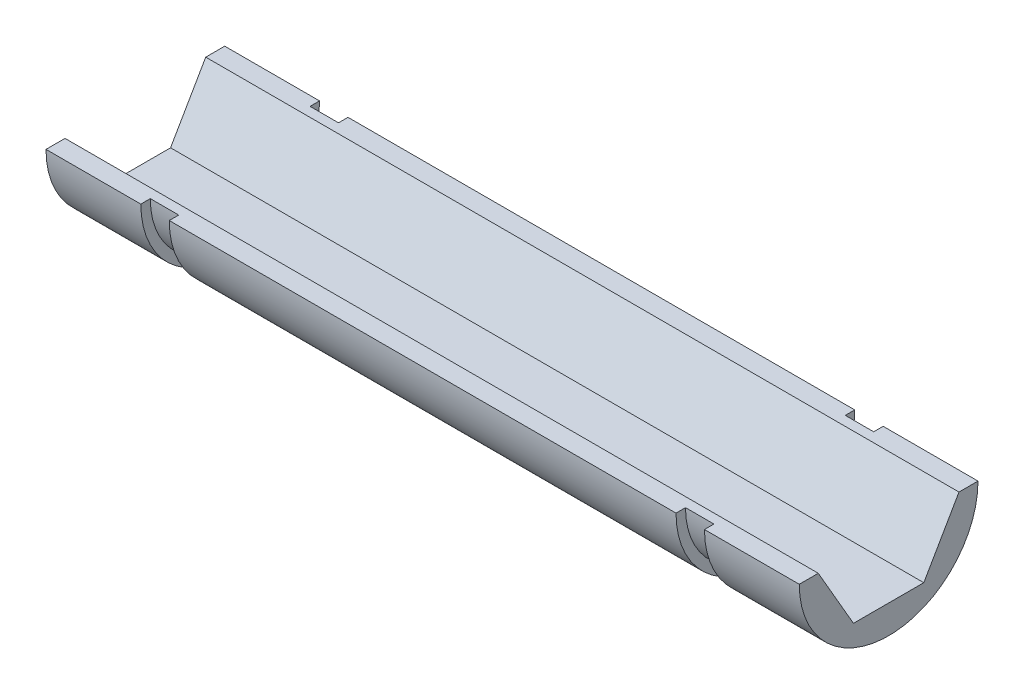
ISO-10303-21;
HEADER;
FILE_DESCRIPTION(('STEP AP214'),'2;1');
FILE_NAME('part.step','',(''),(''),'','','');
FILE_SCHEMA(('AUTOMOTIVE_DESIGN { 1 0 10303 214 1 1 1 1 }'));
ENDSEC;
DATA;
#1=APPLICATION_CONTEXT('core data for automotive mechanical design processes');
#2=APPLICATION_PROTOCOL_DEFINITION('international standard','automotive_design',2000,#1);
#3=PRODUCT_CONTEXT('',#1,'mechanical');
#4=PRODUCT('Part','Part','',(#3));
#5=PRODUCT_RELATED_PRODUCT_CATEGORY('part','',(#4));
#6=PRODUCT_DEFINITION_FORMATION('','',#4);
#7=PRODUCT_DEFINITION_CONTEXT('part definition',#1,'design');
#8=PRODUCT_DEFINITION('design','',#6,#7);
#9=PRODUCT_DEFINITION_SHAPE('','',#8);
#10=(LENGTH_UNIT() NAMED_UNIT(*) SI_UNIT(.MILLI.,.METRE.));
#11=(NAMED_UNIT(*) PLANE_ANGLE_UNIT() SI_UNIT($,.RADIAN.));
#12=(NAMED_UNIT(*) SI_UNIT($,.STERADIAN.) SOLID_ANGLE_UNIT());
#13=UNCERTAINTY_MEASURE_WITH_UNIT(LENGTH_MEASURE(1.E-05),#10,'distance_accuracy_value','');
#14=(GEOMETRIC_REPRESENTATION_CONTEXT(3) GLOBAL_UNCERTAINTY_ASSIGNED_CONTEXT((#13)) GLOBAL_UNIT_ASSIGNED_CONTEXT((#10,
#11,#12)) REPRESENTATION_CONTEXT('',''));
#15=CARTESIAN_POINT('',(0.,0.,0.));
#16=DIRECTION('',(0.,0.,1.));
#17=DIRECTION('',(1.,0.,0.));
#18=AXIS2_PLACEMENT_3D('',#15,#16,#17);
#19=CARTESIAN_POINT('',(0.,0.,0.));
#20=DIRECTION('',(0.,1.,0.));
#21=DIRECTION('',(0.,0.,1.));
#22=AXIS2_PLACEMENT_3D('',#19,#20,#21);
#23=PLANE('',#22);
#24=DIRECTION('',(-1.,0.,0.));
#25=VECTOR('',#24,1.);
#26=CARTESIAN_POINT('',(79.4512,0.,-9.4262));
#27=LINE('',#26,#25);
#28=CARTESIAN_POINT('',(10.,0.,-9.4262));
#29=VERTEX_POINT('',#28);
#30=CARTESIAN_POINT('',(0.,0.,-9.4262));
#31=VERTEX_POINT('',#30);
#32=EDGE_CURVE('E164',#29,#31,#27,.T.);
#33=ORIENTED_EDGE('',*,*,#32,.T.);
#34=DIRECTION('',(0.,0.,1.));
#35=VECTOR('',#34,1.);
#36=CARTESIAN_POINT('',(0.,0.,0.));
#37=LINE('',#36,#35);
#38=CARTESIAN_POINT('',(0.,0.,-7.42033659973275));
#39=VERTEX_POINT('',#38);
#40=EDGE_CURVE('E170',#31,#39,#37,.T.);
#41=ORIENTED_EDGE('',*,*,#40,.T.);
#42=DIRECTION('',(-1.,0.,0.));
#43=VECTOR('',#42,1.);
#44=CARTESIAN_POINT('',(79.4512,0.,-7.42033659973275));
#45=LINE('',#44,#43);
#46=CARTESIAN_POINT('',(79.4512,0.,-7.42033659973275));
#47=VERTEX_POINT('',#46);
#48=EDGE_CURVE('E89',#47,#39,#45,.T.);
#49=ORIENTED_EDGE('',*,*,#48,.F.);
#50=DIRECTION('',(0.,0.,1.));
#51=VECTOR('',#50,1.);
#52=CARTESIAN_POINT('',(79.4512,0.,0.));
#53=LINE('',#52,#51);
#54=CARTESIAN_POINT('',(79.4512,0.,-9.4262));
#55=VERTEX_POINT('',#54);
#56=EDGE_CURVE('E114',#55,#47,#53,.T.);
#57=ORIENTED_EDGE('',*,*,#56,.F.);
#58=DIRECTION('',(-1.,0.,0.));
#59=VECTOR('',#58,1.);
#60=CARTESIAN_POINT('',(79.4512,0.,-9.4262));
#61=LINE('',#60,#59);
#62=CARTESIAN_POINT('',(69.4512,0.,-9.4262));
#63=VERTEX_POINT('',#62);
#64=EDGE_CURVE('E152',#55,#63,#61,.T.);
#65=ORIENTED_EDGE('',*,*,#64,.T.);
#66=DIRECTION('',(0.,0.,-1.));
#67=VECTOR('',#66,1.);
#68=CARTESIAN_POINT('',(69.4512,0.,0.));
#69=LINE('',#68,#67);
#70=CARTESIAN_POINT('',(69.4512,0.,-8.4262));
#71=VERTEX_POINT('',#70);
#72=EDGE_CURVE('E132',#71,#63,#69,.T.);
#73=ORIENTED_EDGE('',*,*,#72,.F.);
#74=DIRECTION('',(1.,0.,0.));
#75=VECTOR('',#74,1.);
#76=CARTESIAN_POINT('',(81.0006,0.,-8.4262));
#77=LINE('',#76,#75);
#78=CARTESIAN_POINT('',(66.4512,0.,-8.4262));
#79=VERTEX_POINT('',#78);
#80=EDGE_CURVE('E126',#79,#71,#77,.T.);
#81=ORIENTED_EDGE('',*,*,#80,.F.);
#82=DIRECTION('',(0.,0.,1.));
#83=VECTOR('',#82,1.);
#84=CARTESIAN_POINT('',(66.4512,0.,0.));
#85=LINE('',#84,#83);
#86=CARTESIAN_POINT('',(66.4512,0.,-9.4262));
#87=VERTEX_POINT('',#86);
#88=EDGE_CURVE('E125',#87,#79,#85,.T.);
#89=ORIENTED_EDGE('',*,*,#88,.F.);
#90=DIRECTION('',(-1.,0.,0.));
#91=VECTOR('',#90,1.);
#92=CARTESIAN_POINT('',(79.4512,0.,-9.4262));
#93=LINE('',#92,#91);
#94=CARTESIAN_POINT('',(13.,0.,-9.4262));
#95=VERTEX_POINT('',#94);
#96=EDGE_CURVE('E158',#87,#95,#93,.T.);
#97=ORIENTED_EDGE('',*,*,#96,.T.);
#98=DIRECTION('',(0.,0.,-1.));
#99=VECTOR('',#98,1.);
#100=CARTESIAN_POINT('',(13.,0.,0.));
#101=LINE('',#100,#99);
#102=CARTESIAN_POINT('',(13.,0.,-8.4262));
#103=VERTEX_POINT('',#102);
#104=EDGE_CURVE('E136',#103,#95,#101,.T.);
#105=ORIENTED_EDGE('',*,*,#104,.F.);
#106=DIRECTION('',(-1.,0.,0.));
#107=VECTOR('',#106,1.);
#108=CARTESIAN_POINT('',(-1.5494,0.,-8.4262));
#109=LINE('',#108,#107);
#110=CARTESIAN_POINT('',(10.,0.,-8.4262));
#111=VERTEX_POINT('',#110);
#112=EDGE_CURVE('E143',#111,#103,#109,.F.);
#113=ORIENTED_EDGE('',*,*,#112,.F.);
#114=DIRECTION('',(0.,0.,1.));
#115=VECTOR('',#114,1.);
#116=CARTESIAN_POINT('',(10.,0.,0.));
#117=LINE('',#116,#115);
#118=EDGE_CURVE('E147',#29,#111,#117,.T.);
#119=ORIENTED_EDGE('',*,*,#118,.F.);
#120=EDGE_LOOP('',(#33,#41,#49,#57,#65,#73,#81,#89,#97,#105,#113,#119));
#121=FACE_BOUND('',#120,.T.);
#122=ADVANCED_FACE('F59',(#121),#23,.T.);
#123=DIRECTION('',(-1.,0.,0.));
#124=VECTOR('',#123,1.);
#125=CARTESIAN_POINT('',(79.4512,0.,7.42033659973275));
#126=LINE('',#125,#124);
#127=CARTESIAN_POINT('',(79.4512,0.,7.42033659973275));
#128=VERTEX_POINT('',#127);
#129=CARTESIAN_POINT('',(0.,0.,7.42033659973275));
#130=VERTEX_POINT('',#129);
#131=EDGE_CURVE('E174',#128,#130,#126,.T.);
#132=ORIENTED_EDGE('',*,*,#131,.T.);
#133=CARTESIAN_POINT('',(0.,0.,9.4262));
#134=VERTEX_POINT('',#133);
#135=EDGE_CURVE('E171',#130,#134,#37,.T.);
#136=ORIENTED_EDGE('',*,*,#135,.T.);
#137=DIRECTION('',(-1.,0.,0.));
#138=VECTOR('',#137,1.);
#139=CARTESIAN_POINT('',(79.4512,0.,9.4262));
#140=LINE('',#139,#138);
#141=CARTESIAN_POINT('',(10.,0.,9.4262));
#142=VERTEX_POINT('',#141);
#143=EDGE_CURVE('E167',#134,#142,#140,.F.);
#144=ORIENTED_EDGE('',*,*,#143,.T.);
#145=CARTESIAN_POINT('',(10.,0.,8.4262));
#146=VERTEX_POINT('',#145);
#147=EDGE_CURVE('E146',#146,#142,#117,.T.);
#148=ORIENTED_EDGE('',*,*,#147,.F.);
#149=DIRECTION('',(-1.,0.,0.));
#150=VECTOR('',#149,1.);
#151=CARTESIAN_POINT('',(-1.5494,0.,8.4262));
#152=LINE('',#151,#150);
#153=CARTESIAN_POINT('',(13.,0.,8.4262));
#154=VERTEX_POINT('',#153);
#155=EDGE_CURVE('E140',#154,#146,#152,.T.);
#156=ORIENTED_EDGE('',*,*,#155,.F.);
#157=CARTESIAN_POINT('',(13.,0.,9.4262));
#158=VERTEX_POINT('',#157);
#159=EDGE_CURVE('E137',#158,#154,#101,.T.);
#160=ORIENTED_EDGE('',*,*,#159,.F.);
#161=DIRECTION('',(-1.,0.,0.));
#162=VECTOR('',#161,1.);
#163=CARTESIAN_POINT('',(79.4512,0.,9.4262));
#164=LINE('',#163,#162);
#165=CARTESIAN_POINT('',(66.4512,0.,9.4262));
#166=VERTEX_POINT('',#165);
#167=EDGE_CURVE('E161',#158,#166,#164,.F.);
#168=ORIENTED_EDGE('',*,*,#167,.T.);
#169=CARTESIAN_POINT('',(66.4512,0.,8.4262));
#170=VERTEX_POINT('',#169);
#171=EDGE_CURVE('E121',#170,#166,#85,.T.);
#172=ORIENTED_EDGE('',*,*,#171,.F.);
#173=DIRECTION('',(1.,0.,0.));
#174=VECTOR('',#173,1.);
#175=CARTESIAN_POINT('',(81.0006,0.,8.4262));
#176=LINE('',#175,#174);
#177=CARTESIAN_POINT('',(69.4512,0.,8.4262));
#178=VERTEX_POINT('',#177);
#179=EDGE_CURVE('E129',#178,#170,#176,.F.);
#180=ORIENTED_EDGE('',*,*,#179,.F.);
#181=CARTESIAN_POINT('',(69.4512,0.,9.4262));
#182=VERTEX_POINT('',#181);
#183=EDGE_CURVE('E133',#182,#178,#69,.T.);
#184=ORIENTED_EDGE('',*,*,#183,.F.);
#185=DIRECTION('',(-1.,0.,0.));
#186=VECTOR('',#185,1.);
#187=CARTESIAN_POINT('',(79.4512,0.,9.4262));
#188=LINE('',#187,#186);
#189=CARTESIAN_POINT('',(79.4512,0.,9.4262));
#190=VERTEX_POINT('',#189);
#191=EDGE_CURVE('E155',#182,#190,#188,.F.);
#192=ORIENTED_EDGE('',*,*,#191,.T.);
#193=EDGE_CURVE('E150',#128,#190,#53,.T.);
#194=ORIENTED_EDGE('',*,*,#193,.F.);
#195=EDGE_LOOP('',(#132,#136,#144,#148,#156,#160,#168,#172,#180,#184,#192,#194));
#196=FACE_BOUND('',#195,.T.);
#197=ADVANCED_FACE('F258',(#196),#23,.T.);
#198=CARTESIAN_POINT('',(79.4512,0.,0.));
#199=DIRECTION('',(-1.,0.,0.));
#200=DIRECTION('',(0.,0.,1.));
#201=AXIS2_PLACEMENT_3D('',#198,#199,#200);
#202=CYLINDRICAL_SURFACE('',#201,9.4262);
#203=ORIENTED_EDGE('',*,*,#32,.F.);
#204=CARTESIAN_POINT('',(10.,0.,0.));
#205=DIRECTION('',(-1.,0.,0.));
#206=DIRECTION('',(0.,0.,1.));
#207=AXIS2_PLACEMENT_3D('',#204,#205,#206);
#208=CIRCLE('',#207,9.4262);
#209=EDGE_CURVE('E190',#29,#142,#208,.T.);
#210=ORIENTED_EDGE('',*,*,#209,.T.);
#211=ORIENTED_EDGE('',*,*,#143,.F.);
#212=CARTESIAN_POINT('',(0.,0.,0.));
#213=DIRECTION('',(1.,0.,0.));
#214=DIRECTION('',(0.,0.,-1.));
#215=AXIS2_PLACEMENT_3D('',#212,#213,#214);
#216=CIRCLE('',#215,9.4262);
#217=EDGE_CURVE('E110',#134,#31,#216,.T.);
#218=ORIENTED_EDGE('',*,*,#217,.T.);
#219=EDGE_LOOP('',(#203,#210,#211,#218));
#220=FACE_BOUND('',#219,.T.);
#221=ADVANCED_FACE('F244',(#220),#202,.T.);
#222=CARTESIAN_POINT('',(10.,9.4262,0.));
#223=DIRECTION('',(1.,0.,0.));
#224=DIRECTION('',(0.,0.,-1.));
#225=AXIS2_PLACEMENT_3D('',#222,#223,#224);
#226=PLANE('',#225);
#227=ORIENTED_EDGE('',*,*,#209,.F.);
#228=ORIENTED_EDGE('',*,*,#118,.T.);
#229=CARTESIAN_POINT('',(10.,0.,0.));
#230=DIRECTION('',(-1.,0.,0.));
#231=DIRECTION('',(0.,0.,1.));
#232=AXIS2_PLACEMENT_3D('',#229,#230,#231);
#233=CIRCLE('',#232,8.4262);
#234=EDGE_CURVE('E180',#111,#146,#233,.T.);
#235=ORIENTED_EDGE('',*,*,#234,.T.);
#236=ORIENTED_EDGE('',*,*,#147,.T.);
#237=EDGE_LOOP('',(#227,#228,#235,#236));
#238=FACE_BOUND('',#237,.T.);
#239=ADVANCED_FACE('F250',(#238),#226,.T.);
#240=CARTESIAN_POINT('',(-1.5494,0.,0.));
#241=DIRECTION('',(-1.,0.,0.));
#242=DIRECTION('',(0.,0.,1.));
#243=AXIS2_PLACEMENT_3D('',#240,#241,#242);
#244=CYLINDRICAL_SURFACE('',#243,8.4262);
#245=ORIENTED_EDGE('',*,*,#234,.F.);
#246=ORIENTED_EDGE('',*,*,#112,.T.);
#247=CARTESIAN_POINT('',(13.,0.,0.));
#248=DIRECTION('',(-1.,0.,0.));
#249=DIRECTION('',(0.,0.,1.));
#250=AXIS2_PLACEMENT_3D('',#247,#248,#249);
#251=CIRCLE('',#250,8.4262);
#252=EDGE_CURVE('E183',#103,#154,#251,.T.);
#253=ORIENTED_EDGE('',*,*,#252,.T.);
#254=ORIENTED_EDGE('',*,*,#155,.T.);
#255=EDGE_LOOP('',(#245,#246,#253,#254));
#256=FACE_BOUND('',#255,.T.);
#257=ADVANCED_FACE('F304',(#256),#244,.T.);
#258=ORIENTED_EDGE('',*,*,#64,.F.);
#259=CARTESIAN_POINT('',(79.4512,0.,0.));
#260=DIRECTION('',(1.,0.,0.));
#261=DIRECTION('',(0.,0.,-1.));
#262=AXIS2_PLACEMENT_3D('',#259,#260,#261);
#263=CIRCLE('',#262,9.4262);
#264=EDGE_CURVE('E124',#190,#55,#263,.T.);
#265=ORIENTED_EDGE('',*,*,#264,.F.);
#266=ORIENTED_EDGE('',*,*,#191,.F.);
#267=CARTESIAN_POINT('',(69.4512,0.,0.));
#268=DIRECTION('',(-1.,0.,0.));
#269=DIRECTION('',(0.,0.,1.));
#270=AXIS2_PLACEMENT_3D('',#267,#268,#269);
#271=CIRCLE('',#270,9.4262);
#272=EDGE_CURVE('E13',#63,#182,#271,.T.);
#273=ORIENTED_EDGE('',*,*,#272,.F.);
#274=EDGE_LOOP('',(#258,#265,#266,#273));
#275=FACE_BOUND('',#274,.T.);
#276=ADVANCED_FACE('F300',(#275),#202,.T.);
#277=CARTESIAN_POINT('',(69.4512,9.4262,0.));
#278=DIRECTION('',(-1.,0.,0.));
#279=DIRECTION('',(0.,0.,-1.));
#280=AXIS2_PLACEMENT_3D('',#277,#278,#279);
#281=PLANE('',#280);
#282=ORIENTED_EDGE('',*,*,#272,.T.);
#283=ORIENTED_EDGE('',*,*,#183,.T.);
#284=CARTESIAN_POINT('',(69.4512,0.,0.));
#285=DIRECTION('',(-1.,0.,0.));
#286=DIRECTION('',(0.,0.,1.));
#287=AXIS2_PLACEMENT_3D('',#284,#285,#286);
#288=CIRCLE('',#287,8.4262);
#289=EDGE_CURVE('E193',#71,#178,#288,.T.);
#290=ORIENTED_EDGE('',*,*,#289,.F.);
#291=ORIENTED_EDGE('',*,*,#72,.T.);
#292=EDGE_LOOP('',(#282,#283,#290,#291));
#293=FACE_BOUND('',#292,.T.);
#294=ADVANCED_FACE('F293',(#293),#281,.T.);
#295=CARTESIAN_POINT('',(81.0006,0.,0.));
#296=DIRECTION('',(1.,0.,0.));
#297=DIRECTION('',(0.,0.,1.));
#298=AXIS2_PLACEMENT_3D('',#295,#296,#297);
#299=CYLINDRICAL_SURFACE('',#298,8.4262);
#300=ORIENTED_EDGE('',*,*,#289,.T.);
#301=ORIENTED_EDGE('',*,*,#179,.T.);
#302=CARTESIAN_POINT('',(66.4512,0.,0.));
#303=DIRECTION('',(-1.,0.,0.));
#304=DIRECTION('',(0.,0.,1.));
#305=AXIS2_PLACEMENT_3D('',#302,#303,#304);
#306=CIRCLE('',#305,8.4262);
#307=EDGE_CURVE('E196',#79,#170,#306,.T.);
#308=ORIENTED_EDGE('',*,*,#307,.F.);
#309=ORIENTED_EDGE('',*,*,#80,.T.);
#310=EDGE_LOOP('',(#300,#301,#308,#309));
#311=FACE_BOUND('',#310,.T.);
#312=ADVANCED_FACE('F295',(#311),#299,.T.);
#313=ORIENTED_EDGE('',*,*,#96,.F.);
#314=CARTESIAN_POINT('',(66.4512,0.,0.));
#315=DIRECTION('',(-1.,0.,0.));
#316=DIRECTION('',(0.,0.,1.));
#317=AXIS2_PLACEMENT_3D('',#314,#315,#316);
#318=CIRCLE('',#317,9.4262);
#319=EDGE_CURVE('E68',#87,#166,#318,.T.);
#320=ORIENTED_EDGE('',*,*,#319,.T.);
#321=ORIENTED_EDGE('',*,*,#167,.F.);
#322=CARTESIAN_POINT('',(13.,0.,0.));
#323=DIRECTION('',(-1.,0.,0.));
#324=DIRECTION('',(0.,0.,1.));
#325=AXIS2_PLACEMENT_3D('',#322,#323,#324);
#326=CIRCLE('',#325,9.4262);
#327=EDGE_CURVE('E187',#95,#158,#326,.T.);
#328=ORIENTED_EDGE('',*,*,#327,.F.);
#329=EDGE_LOOP('',(#313,#320,#321,#328));
#330=FACE_BOUND('',#329,.T.);
#331=ADVANCED_FACE('F204',(#330),#202,.T.);
#332=CARTESIAN_POINT('',(66.4512,9.4262,0.));
#333=DIRECTION('',(1.,0.,0.));
#334=DIRECTION('',(0.,0.,1.));
#335=AXIS2_PLACEMENT_3D('',#332,#333,#334);
#336=PLANE('',#335);
#337=ORIENTED_EDGE('',*,*,#319,.F.);
#338=ORIENTED_EDGE('',*,*,#88,.T.);
#339=ORIENTED_EDGE('',*,*,#307,.T.);
#340=ORIENTED_EDGE('',*,*,#171,.T.);
#341=EDGE_LOOP('',(#337,#338,#339,#340));
#342=FACE_BOUND('',#341,.T.);
#343=ADVANCED_FACE('F61',(#342),#336,.T.);
#344=CARTESIAN_POINT('',(13.,9.4262,0.));
#345=DIRECTION('',(-1.,0.,0.));
#346=DIRECTION('',(0.,0.,1.));
#347=AXIS2_PLACEMENT_3D('',#344,#345,#346);
#348=PLANE('',#347);
#349=ORIENTED_EDGE('',*,*,#327,.T.);
#350=ORIENTED_EDGE('',*,*,#159,.T.);
#351=ORIENTED_EDGE('',*,*,#252,.F.);
#352=ORIENTED_EDGE('',*,*,#104,.T.);
#353=EDGE_LOOP('',(#349,#350,#351,#352));
#354=FACE_BOUND('',#353,.T.);
#355=ADVANCED_FACE('F321',(#354),#348,.T.);
#356=CARTESIAN_POINT('',(79.4512,-6.4262,0.));
#357=DIRECTION('',(0.,1.,0.));
#358=DIRECTION('',(0.,0.,1.));
#359=AXIS2_PLACEMENT_3D('',#356,#357,#358);
#360=PLANE('',#359);
#361=DIRECTION('',(0.,0.,-1.));
#362=VECTOR('',#361,1.);
#363=CARTESIAN_POINT('',(0.,-6.4262,0.));
#364=LINE('',#363,#362);
#365=CARTESIAN_POINT('',(0.,-6.4262,3.71016829986637));
#366=VERTEX_POINT('',#365);
#367=CARTESIAN_POINT('',(0.,-6.4262,-3.71016829986638));
#368=VERTEX_POINT('',#367);
#369=EDGE_CURVE('E184',#366,#368,#364,.T.);
#370=ORIENTED_EDGE('',*,*,#369,.F.);
#371=DIRECTION('',(-1.,0.,0.));
#372=VECTOR('',#371,1.);
#373=CARTESIAN_POINT('',(79.4512,-6.4262,3.71016829986637));
#374=LINE('',#373,#372);
#375=CARTESIAN_POINT('',(79.4512,-6.4262,3.71016829986637));
#376=VERTEX_POINT('',#375);
#377=EDGE_CURVE('E101',#376,#366,#374,.T.);
#378=ORIENTED_EDGE('',*,*,#377,.F.);
#379=DIRECTION('',(0.,0.,-1.));
#380=VECTOR('',#379,1.);
#381=CARTESIAN_POINT('',(79.4512,-6.4262,0.));
#382=LINE('',#381,#380);
#383=CARTESIAN_POINT('',(79.4512,-6.4262,-3.71016829986638));
#384=VERTEX_POINT('',#383);
#385=EDGE_CURVE('E95',#376,#384,#382,.T.);
#386=ORIENTED_EDGE('',*,*,#385,.T.);
#387=DIRECTION('',(-1.,0.,0.));
#388=VECTOR('',#387,1.);
#389=CARTESIAN_POINT('',(79.4512,-6.4262,-3.71016829986638));
#390=LINE('',#389,#388);
#391=EDGE_CURVE('E98',#384,#368,#390,.T.);
#392=ORIENTED_EDGE('',*,*,#391,.T.);
#393=EDGE_LOOP('',(#370,#378,#386,#392));
#394=FACE_BOUND('',#393,.T.);
#395=ADVANCED_FACE('F97',(#394),#360,.T.);
#396=CARTESIAN_POINT('',(79.4512,0.,0.));
#397=DIRECTION('',(1.,0.,0.));
#398=DIRECTION('',(0.,0.,-1.));
#399=AXIS2_PLACEMENT_3D('',#396,#397,#398);
#400=PLANE('',#399);
#401=ORIENTED_EDGE('',*,*,#264,.T.);
#402=ORIENTED_EDGE('',*,*,#56,.T.);
#403=DIRECTION('',(0.,0.866025403784439,-0.5));
#404=VECTOR('',#403,1.);
#405=CARTESIAN_POINT('',(79.4512,-3.2131,-5.56525244979956));
#406=LINE('',#405,#404);
#407=EDGE_CURVE('E106',#384,#47,#406,.T.);
#408=ORIENTED_EDGE('',*,*,#407,.F.);
#409=ORIENTED_EDGE('',*,*,#385,.F.);
#410=DIRECTION('',(0.,-0.866025403784439,-0.5));
#411=VECTOR('',#410,1.);
#412=CARTESIAN_POINT('',(79.4512,-3.2131,5.56525244979956));
#413=LINE('',#412,#411);
#414=EDGE_CURVE('E115',#128,#376,#413,.T.);
#415=ORIENTED_EDGE('',*,*,#414,.F.);
#416=ORIENTED_EDGE('',*,*,#193,.T.);
#417=EDGE_LOOP('',(#401,#402,#408,#409,#415,#416));
#418=FACE_BOUND('',#417,.T.);
#419=ADVANCED_FACE('F113',(#418),#400,.T.);
#420=CARTESIAN_POINT('',(0.,0.,0.));
#421=DIRECTION('',(1.,0.,0.));
#422=DIRECTION('',(0.,0.,-1.));
#423=AXIS2_PLACEMENT_3D('',#420,#421,#422);
#424=PLANE('',#423);
#425=ORIENTED_EDGE('',*,*,#40,.F.);
#426=ORIENTED_EDGE('',*,*,#217,.F.);
#427=ORIENTED_EDGE('',*,*,#135,.F.);
#428=DIRECTION('',(0.,-0.866025403784439,-0.5));
#429=VECTOR('',#428,1.);
#430=CARTESIAN_POINT('',(0.,-3.2131,5.56525244979956));
#431=LINE('',#430,#429);
#432=EDGE_CURVE('E105',#130,#366,#431,.T.);
#433=ORIENTED_EDGE('',*,*,#432,.T.);
#434=ORIENTED_EDGE('',*,*,#369,.T.);
#435=DIRECTION('',(0.,0.866025403784439,-0.5));
#436=VECTOR('',#435,1.);
#437=CARTESIAN_POINT('',(0.,-3.2131,-5.56525244979956));
#438=LINE('',#437,#436);
#439=EDGE_CURVE('E76',#368,#39,#438,.T.);
#440=ORIENTED_EDGE('',*,*,#439,.T.);
#441=EDGE_LOOP('',(#425,#426,#427,#433,#434,#440));
#442=FACE_BOUND('',#441,.T.);
#443=ADVANCED_FACE('F229',(#442),#424,.F.);
#444=CARTESIAN_POINT('',(79.4512,-3.2131,5.56525244979956));
#445=DIRECTION('',(0.,0.5,-0.866025403784439));
#446=DIRECTION('',(0.,0.866025403784439,0.5));
#447=AXIS2_PLACEMENT_3D('',#444,#445,#446);
#448=PLANE('',#447);
#449=ORIENTED_EDGE('',*,*,#432,.F.);
#450=ORIENTED_EDGE('',*,*,#131,.F.);
#451=ORIENTED_EDGE('',*,*,#414,.T.);
#452=ORIENTED_EDGE('',*,*,#377,.T.);
#453=EDGE_LOOP('',(#449,#450,#451,#452));
#454=FACE_BOUND('',#453,.T.);
#455=ADVANCED_FACE('F223',(#454),#448,.T.);
#456=CARTESIAN_POINT('',(79.4512,-3.2131,-5.56525244979956));
#457=DIRECTION('',(0.,0.5,0.866025403784439));
#458=DIRECTION('',(0.,-0.866025403784439,0.5));
#459=AXIS2_PLACEMENT_3D('',#456,#457,#458);
#460=PLANE('',#459);
#461=ORIENTED_EDGE('',*,*,#439,.F.);
#462=ORIENTED_EDGE('',*,*,#391,.F.);
#463=ORIENTED_EDGE('',*,*,#407,.T.);
#464=ORIENTED_EDGE('',*,*,#48,.T.);
#465=EDGE_LOOP('',(#461,#462,#463,#464));
#466=FACE_BOUND('',#465,.T.);
#467=ADVANCED_FACE('F109',(#466),#460,.T.);
#468=CLOSED_SHELL('',(#122,#197,#221,#239,#257,#276,#294,#312,#331,#343,#355,#395,#419,#443,
#455,#467));
#469=MANIFOLD_SOLID_BREP('B2',#468);
#470=ADVANCED_BREP_SHAPE_REPRESENTATION('',(#18,#469),#14);
#471=SHAPE_DEFINITION_REPRESENTATION(#9,#470);
ENDSEC;
END-ISO-10303-21;
